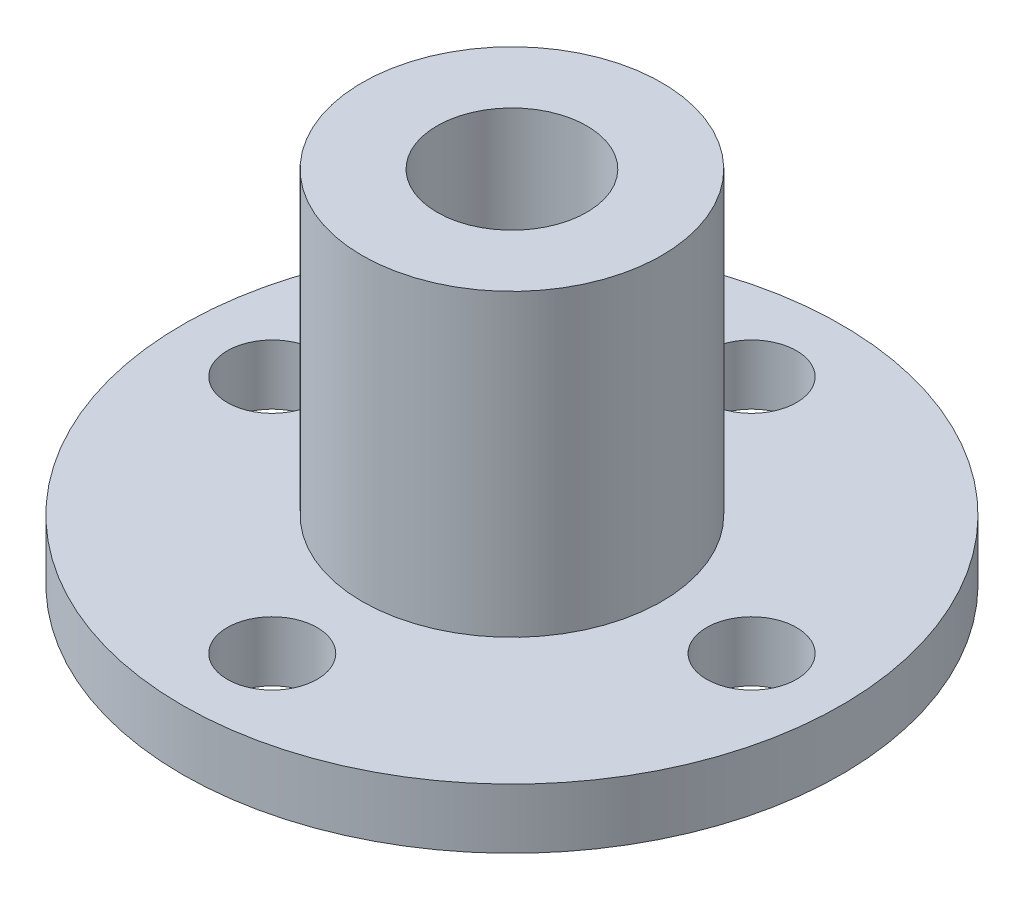
ISO-10303-21;
HEADER;
FILE_DESCRIPTION(('STEP AP214'),'2;1');
FILE_NAME('part.step','',(''),(''),'','','');
FILE_SCHEMA(('AUTOMOTIVE_DESIGN { 1 0 10303 214 1 1 1 1 }'));
ENDSEC;
DATA;
#1=APPLICATION_CONTEXT('core data for automotive mechanical design processes');
#2=APPLICATION_PROTOCOL_DEFINITION('international standard','automotive_design',2000,#1);
#3=PRODUCT_CONTEXT('',#1,'mechanical');
#4=PRODUCT('Part','Part','',(#3));
#5=PRODUCT_RELATED_PRODUCT_CATEGORY('part','',(#4));
#6=PRODUCT_DEFINITION_FORMATION('','',#4);
#7=PRODUCT_DEFINITION_CONTEXT('part definition',#1,'design');
#8=PRODUCT_DEFINITION('design','',#6,#7);
#9=PRODUCT_DEFINITION_SHAPE('','',#8);
#10=(LENGTH_UNIT() NAMED_UNIT(*) SI_UNIT(.MILLI.,.METRE.));
#11=(NAMED_UNIT(*) PLANE_ANGLE_UNIT() SI_UNIT($,.RADIAN.));
#12=(NAMED_UNIT(*) SI_UNIT($,.STERADIAN.) SOLID_ANGLE_UNIT());
#13=UNCERTAINTY_MEASURE_WITH_UNIT(LENGTH_MEASURE(1.E-05),#10,'distance_accuracy_value','');
#14=(GEOMETRIC_REPRESENTATION_CONTEXT(3) GLOBAL_UNCERTAINTY_ASSIGNED_CONTEXT((#13)) GLOBAL_UNIT_ASSIGNED_CONTEXT((#10,
#11,#12)) REPRESENTATION_CONTEXT('',''));
#15=CARTESIAN_POINT('',(0.,0.,0.));
#16=DIRECTION('',(0.,0.,1.));
#17=DIRECTION('',(1.,0.,0.));
#18=AXIS2_PLACEMENT_3D('',#15,#16,#17);
#19=CARTESIAN_POINT('',(0.,2.,0.));
#20=DIRECTION('',(0.,1.,0.));
#21=DIRECTION('',(0.,0.,1.));
#22=AXIS2_PLACEMENT_3D('',#19,#20,#21);
#23=PLANE('',#22);
#24=CARTESIAN_POINT('',(-8.,2.,0.));
#25=DIRECTION('',(0.,1.,0.));
#26=DIRECTION('',(0.,0.,1.));
#27=AXIS2_PLACEMENT_3D('',#24,#25,#26);
#28=CIRCLE('',#27,1.5);
#29=CARTESIAN_POINT('',(-8.,2.,1.49999999999992));
#30=VERTEX_POINT('',#29);
#31=EDGE_CURVE('E81',#30,#30,#28,.T.);
#32=ORIENTED_EDGE('',*,*,#31,.F.);
#33=EDGE_LOOP('',(#32));
#34=FACE_BOUND('',#33,.T.);
#35=CARTESIAN_POINT('',(8.,2.,0.));
#36=DIRECTION('',(0.,1.,0.));
#37=DIRECTION('',(0.,0.,1.));
#38=AXIS2_PLACEMENT_3D('',#35,#36,#37);
#39=CIRCLE('',#38,1.5);
#40=CARTESIAN_POINT('',(8.,2.,1.50000000000003));
#41=VERTEX_POINT('',#40);
#42=EDGE_CURVE('E68',#41,#41,#39,.T.);
#43=ORIENTED_EDGE('',*,*,#42,.F.);
#44=EDGE_LOOP('',(#43));
#45=FACE_BOUND('',#44,.T.);
#46=CARTESIAN_POINT('',(0.,2.,-8.));
#47=DIRECTION('',(0.,1.,0.));
#48=DIRECTION('',(0.,0.,1.));
#49=AXIS2_PLACEMENT_3D('',#46,#47,#48);
#50=CIRCLE('',#49,1.5);
#51=CARTESIAN_POINT('',(0.,2.,-6.5));
#52=VERTEX_POINT('',#51);
#53=EDGE_CURVE('E55',#52,#52,#50,.T.);
#54=ORIENTED_EDGE('',*,*,#53,.F.);
#55=EDGE_LOOP('',(#54));
#56=FACE_BOUND('',#55,.T.);
#57=CARTESIAN_POINT('',(0.,2.,0.));
#58=DIRECTION('',(0.,1.,0.));
#59=DIRECTION('',(0.,0.,1.));
#60=AXIS2_PLACEMENT_3D('',#57,#58,#59);
#61=CIRCLE('',#60,11.);
#62=CARTESIAN_POINT('',(0.,2.,11.));
#63=VERTEX_POINT('',#62);
#64=EDGE_CURVE('E10',#63,#63,#61,.T.);
#65=ORIENTED_EDGE('',*,*,#64,.T.);
#66=EDGE_LOOP('',(#65));
#67=FACE_BOUND('',#66,.T.);
#68=CARTESIAN_POINT('',(0.,2.,8.));
#69=DIRECTION('',(0.,1.,0.));
#70=DIRECTION('',(0.,0.,1.));
#71=AXIS2_PLACEMENT_3D('',#68,#69,#70);
#72=CIRCLE('',#71,1.5);
#73=CARTESIAN_POINT('',(0.,2.,9.5));
#74=VERTEX_POINT('',#73);
#75=EDGE_CURVE('E73',#74,#74,#72,.T.);
#76=ORIENTED_EDGE('',*,*,#75,.F.);
#77=EDGE_LOOP('',(#76));
#78=FACE_BOUND('',#77,.T.);
#79=CARTESIAN_POINT('',(0.,2.,0.));
#80=DIRECTION('',(0.,1.,0.));
#81=DIRECTION('',(0.,0.,1.));
#82=AXIS2_PLACEMENT_3D('',#79,#80,#81);
#83=CIRCLE('',#82,5.);
#84=CARTESIAN_POINT('',(0.,2.,5.));
#85=VERTEX_POINT('',#84);
#86=EDGE_CURVE('E93',#85,#85,#83,.T.);
#87=ORIENTED_EDGE('',*,*,#86,.F.);
#88=EDGE_LOOP('',(#87));
#89=FACE_BOUND('',#88,.T.);
#90=ADVANCED_FACE('F42',(#34,#45,#56,#67,#78,#89),#23,.T.);
#91=CARTESIAN_POINT('',(0.,0.,0.));
#92=DIRECTION('',(0.,1.,0.));
#93=DIRECTION('',(0.,0.,1.));
#94=AXIS2_PLACEMENT_3D('',#91,#92,#93);
#95=PLANE('',#94);
#96=CARTESIAN_POINT('',(0.,0.,0.));
#97=DIRECTION('',(0.,1.,0.));
#98=DIRECTION('',(0.,0.,1.));
#99=AXIS2_PLACEMENT_3D('',#96,#97,#98);
#100=CIRCLE('',#99,11.);
#101=CARTESIAN_POINT('',(0.,0.,11.));
#102=VERTEX_POINT('',#101);
#103=EDGE_CURVE('E46',#102,#102,#100,.T.);
#104=ORIENTED_EDGE('',*,*,#103,.F.);
#105=EDGE_LOOP('',(#104));
#106=FACE_BOUND('',#105,.T.);
#107=CARTESIAN_POINT('',(0.,0.,-8.));
#108=DIRECTION('',(0.,1.,0.));
#109=DIRECTION('',(0.,0.,1.));
#110=AXIS2_PLACEMENT_3D('',#107,#108,#109);
#111=CIRCLE('',#110,1.5);
#112=CARTESIAN_POINT('',(0.,0.,-6.5));
#113=VERTEX_POINT('',#112);
#114=EDGE_CURVE('E57',#113,#113,#111,.T.);
#115=ORIENTED_EDGE('',*,*,#114,.T.);
#116=EDGE_LOOP('',(#115));
#117=FACE_BOUND('',#116,.T.);
#118=CARTESIAN_POINT('',(0.,0.,0.));
#119=DIRECTION('',(0.,1.,0.));
#120=DIRECTION('',(0.,0.,1.));
#121=AXIS2_PLACEMENT_3D('',#118,#119,#120);
#122=CIRCLE('',#121,2.5);
#123=CARTESIAN_POINT('',(0.,0.,2.5));
#124=VERTEX_POINT('',#123);
#125=EDGE_CURVE('E61',#124,#124,#122,.T.);
#126=ORIENTED_EDGE('',*,*,#125,.T.);
#127=EDGE_LOOP('',(#126));
#128=FACE_BOUND('',#127,.T.);
#129=CARTESIAN_POINT('',(8.,0.,0.));
#130=DIRECTION('',(0.,1.,0.));
#131=DIRECTION('',(0.,0.,1.));
#132=AXIS2_PLACEMENT_3D('',#129,#130,#131);
#133=CIRCLE('',#132,1.5);
#134=CARTESIAN_POINT('',(8.,0.,1.50000000000003));
#135=VERTEX_POINT('',#134);
#136=EDGE_CURVE('E69',#135,#135,#133,.T.);
#137=ORIENTED_EDGE('',*,*,#136,.T.);
#138=EDGE_LOOP('',(#137));
#139=FACE_BOUND('',#138,.T.);
#140=CARTESIAN_POINT('',(0.,0.,8.));
#141=DIRECTION('',(0.,1.,0.));
#142=DIRECTION('',(0.,0.,1.));
#143=AXIS2_PLACEMENT_3D('',#140,#141,#142);
#144=CIRCLE('',#143,1.5);
#145=CARTESIAN_POINT('',(0.,0.,9.5));
#146=VERTEX_POINT('',#145);
#147=EDGE_CURVE('E77',#146,#146,#144,.T.);
#148=ORIENTED_EDGE('',*,*,#147,.T.);
#149=EDGE_LOOP('',(#148));
#150=FACE_BOUND('',#149,.T.);
#151=CARTESIAN_POINT('',(-8.,0.,0.));
#152=DIRECTION('',(0.,1.,0.));
#153=DIRECTION('',(0.,0.,1.));
#154=AXIS2_PLACEMENT_3D('',#151,#152,#153);
#155=CIRCLE('',#154,1.5);
#156=CARTESIAN_POINT('',(-8.,0.,1.49999999999992));
#157=VERTEX_POINT('',#156);
#158=EDGE_CURVE('E85',#157,#157,#155,.T.);
#159=ORIENTED_EDGE('',*,*,#158,.T.);
#160=EDGE_LOOP('',(#159));
#161=FACE_BOUND('',#160,.T.);
#162=ADVANCED_FACE('F124',(#106,#117,#128,#139,#150,#161),#95,.F.);
#163=CARTESIAN_POINT('',(0.,2.,0.));
#164=DIRECTION('',(0.,-1.,0.));
#165=DIRECTION('',(0.,0.,-1.));
#166=AXIS2_PLACEMENT_3D('',#163,#164,#165);
#167=CYLINDRICAL_SURFACE('',#166,11.);
#168=ORIENTED_EDGE('',*,*,#64,.F.);
#169=EDGE_LOOP('',(#168));
#170=FACE_BOUND('',#169,.T.);
#171=ORIENTED_EDGE('',*,*,#103,.T.);
#172=EDGE_LOOP('',(#171));
#173=FACE_BOUND('',#172,.T.);
#174=ADVANCED_FACE('F44',(#170,#173),#167,.T.);
#175=CARTESIAN_POINT('',(0.,2.,-8.));
#176=DIRECTION('',(0.,-1.,0.));
#177=DIRECTION('',(0.,0.,-1.));
#178=AXIS2_PLACEMENT_3D('',#175,#176,#177);
#179=CYLINDRICAL_SURFACE('',#178,1.5);
#180=ORIENTED_EDGE('',*,*,#53,.T.);
#181=EDGE_LOOP('',(#180));
#182=FACE_BOUND('',#181,.T.);
#183=ORIENTED_EDGE('',*,*,#114,.F.);
#184=EDGE_LOOP('',(#183));
#185=FACE_BOUND('',#184,.T.);
#186=ADVANCED_FACE('F134',(#182,#185),#179,.F.);
#187=CARTESIAN_POINT('',(0.,2.,0.));
#188=DIRECTION('',(0.,-1.,0.));
#189=DIRECTION('',(0.,0.,-1.));
#190=AXIS2_PLACEMENT_3D('',#187,#188,#189);
#191=CYLINDRICAL_SURFACE('',#190,2.5);
#192=ORIENTED_EDGE('',*,*,#125,.F.);
#193=EDGE_LOOP('',(#192));
#194=FACE_BOUND('',#193,.T.);
#195=CARTESIAN_POINT('',(0.,12.,0.));
#196=DIRECTION('',(0.,1.,0.));
#197=DIRECTION('',(0.,0.,1.));
#198=AXIS2_PLACEMENT_3D('',#195,#196,#197);
#199=CIRCLE('',#198,2.5);
#200=CARTESIAN_POINT('',(0.,12.,2.5));
#201=VERTEX_POINT('',#200);
#202=EDGE_CURVE('E97',#201,#201,#199,.T.);
#203=ORIENTED_EDGE('',*,*,#202,.T.);
#204=EDGE_LOOP('',(#203));
#205=FACE_BOUND('',#204,.T.);
#206=ADVANCED_FACE('F105',(#194,#205),#191,.F.);
#207=CARTESIAN_POINT('',(8.,2.,0.));
#208=DIRECTION('',(0.,-1.,0.));
#209=DIRECTION('',(0.,0.,-1.));
#210=AXIS2_PLACEMENT_3D('',#207,#208,#209);
#211=CYLINDRICAL_SURFACE('',#210,1.5);
#212=ORIENTED_EDGE('',*,*,#42,.T.);
#213=EDGE_LOOP('',(#212));
#214=FACE_BOUND('',#213,.T.);
#215=ORIENTED_EDGE('',*,*,#136,.F.);
#216=EDGE_LOOP('',(#215));
#217=FACE_BOUND('',#216,.T.);
#218=ADVANCED_FACE('F139',(#214,#217),#211,.F.);
#219=CARTESIAN_POINT('',(0.,2.,8.));
#220=DIRECTION('',(0.,-1.,0.));
#221=DIRECTION('',(0.,0.,-1.));
#222=AXIS2_PLACEMENT_3D('',#219,#220,#221);
#223=CYLINDRICAL_SURFACE('',#222,1.5);
#224=ORIENTED_EDGE('',*,*,#75,.T.);
#225=EDGE_LOOP('',(#224));
#226=FACE_BOUND('',#225,.T.);
#227=ORIENTED_EDGE('',*,*,#147,.F.);
#228=EDGE_LOOP('',(#227));
#229=FACE_BOUND('',#228,.T.);
#230=ADVANCED_FACE('F120',(#226,#229),#223,.F.);
#231=CARTESIAN_POINT('',(-8.,2.,0.));
#232=DIRECTION('',(0.,-1.,0.));
#233=DIRECTION('',(0.,0.,-1.));
#234=AXIS2_PLACEMENT_3D('',#231,#232,#233);
#235=CYLINDRICAL_SURFACE('',#234,1.5);
#236=ORIENTED_EDGE('',*,*,#31,.T.);
#237=EDGE_LOOP('',(#236));
#238=FACE_BOUND('',#237,.T.);
#239=ORIENTED_EDGE('',*,*,#158,.F.);
#240=EDGE_LOOP('',(#239));
#241=FACE_BOUND('',#240,.T.);
#242=ADVANCED_FACE('F110',(#238,#241),#235,.F.);
#243=CARTESIAN_POINT('',(0.,12.,0.));
#244=DIRECTION('',(0.,1.,0.));
#245=DIRECTION('',(0.,0.,1.));
#246=AXIS2_PLACEMENT_3D('',#243,#244,#245);
#247=PLANE('',#246);
#248=CARTESIAN_POINT('',(0.,12.,0.));
#249=DIRECTION('',(0.,1.,0.));
#250=DIRECTION('',(0.,0.,1.));
#251=AXIS2_PLACEMENT_3D('',#248,#249,#250);
#252=CIRCLE('',#251,5.);
#253=CARTESIAN_POINT('',(0.,12.,5.));
#254=VERTEX_POINT('',#253);
#255=EDGE_CURVE('E89',#254,#254,#252,.T.);
#256=ORIENTED_EDGE('',*,*,#255,.T.);
#257=EDGE_LOOP('',(#256));
#258=FACE_BOUND('',#257,.T.);
#259=ORIENTED_EDGE('',*,*,#202,.F.);
#260=EDGE_LOOP('',(#259));
#261=FACE_BOUND('',#260,.T.);
#262=ADVANCED_FACE('F107',(#258,#261),#247,.T.);
#263=CARTESIAN_POINT('',(0.,12.,0.));
#264=DIRECTION('',(0.,-1.,0.));
#265=DIRECTION('',(0.,0.,-1.));
#266=AXIS2_PLACEMENT_3D('',#263,#264,#265);
#267=CYLINDRICAL_SURFACE('',#266,5.);
#268=ORIENTED_EDGE('',*,*,#255,.F.);
#269=EDGE_LOOP('',(#268));
#270=FACE_BOUND('',#269,.T.);
#271=ORIENTED_EDGE('',*,*,#86,.T.);
#272=EDGE_LOOP('',(#271));
#273=FACE_BOUND('',#272,.T.);
#274=ADVANCED_FACE('F109',(#270,#273),#267,.T.);
#275=CLOSED_SHELL('',(#90,#162,#174,#186,#206,#218,#230,#242,#262,#274));
#276=MANIFOLD_SOLID_BREP('B2',#275);
#277=ADVANCED_BREP_SHAPE_REPRESENTATION('',(#18,#276),#14);
#278=SHAPE_DEFINITION_REPRESENTATION(#9,#277);
ENDSEC;
END-ISO-10303-21;
